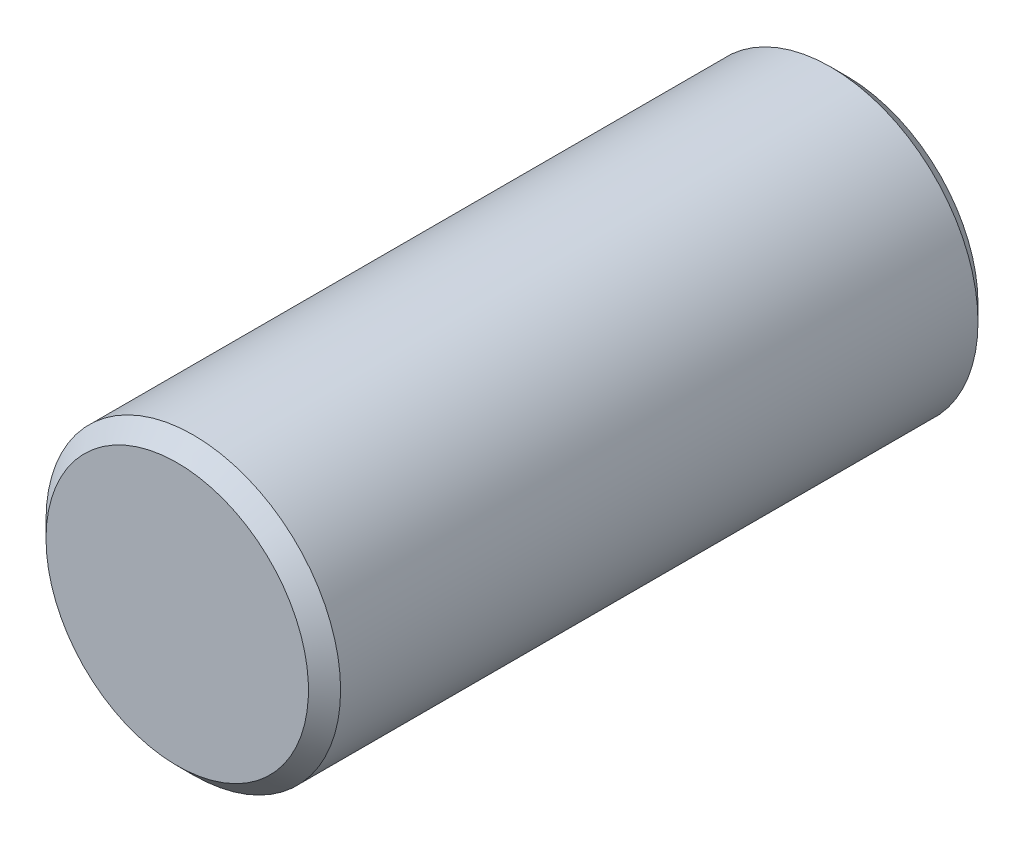
ISO-10303-21;
HEADER;
FILE_DESCRIPTION(('STEP AP214'),'2;1');
FILE_NAME('part.step','',(''),(''),'','','');
FILE_SCHEMA(('AUTOMOTIVE_DESIGN { 1 0 10303 214 1 1 1 1 }'));
ENDSEC;
DATA;
#1=APPLICATION_CONTEXT('core data for automotive mechanical design processes');
#2=APPLICATION_PROTOCOL_DEFINITION('international standard','automotive_design',2000,#1);
#3=PRODUCT_CONTEXT('',#1,'mechanical');
#4=PRODUCT('Part','Part','',(#3));
#5=PRODUCT_RELATED_PRODUCT_CATEGORY('part','',(#4));
#6=PRODUCT_DEFINITION_FORMATION('','',#4);
#7=PRODUCT_DEFINITION_CONTEXT('part definition',#1,'design');
#8=PRODUCT_DEFINITION('design','',#6,#7);
#9=PRODUCT_DEFINITION_SHAPE('','',#8);
#10=(LENGTH_UNIT() NAMED_UNIT(*) SI_UNIT(.MILLI.,.METRE.));
#11=(NAMED_UNIT(*) PLANE_ANGLE_UNIT() SI_UNIT($,.RADIAN.));
#12=(NAMED_UNIT(*) SI_UNIT($,.STERADIAN.) SOLID_ANGLE_UNIT());
#13=UNCERTAINTY_MEASURE_WITH_UNIT(LENGTH_MEASURE(1.E-05),#10,'distance_accuracy_value','');
#14=(GEOMETRIC_REPRESENTATION_CONTEXT(3) GLOBAL_UNCERTAINTY_ASSIGNED_CONTEXT((#13)) GLOBAL_UNIT_ASSIGNED_CONTEXT((#10,
#11,#12)) REPRESENTATION_CONTEXT('',''));
#15=CARTESIAN_POINT('',(0.,0.,0.));
#16=DIRECTION('',(0.,0.,1.));
#17=DIRECTION('',(1.,0.,0.));
#18=AXIS2_PLACEMENT_3D('',#15,#16,#17);
#19=CARTESIAN_POINT('',(1.11022302462516E-12,2.22044604925031E-13,62.499999999999));
#20=DIRECTION('',(0.,0.,-0.999999999999983));
#21=DIRECTION('',(-1.,0.,0.));
#22=AXIS2_PLACEMENT_3D('',#19,#20,#21);
#23=CYLINDRICAL_SURFACE('',#22,27.5);
#24=CARTESIAN_POINT('',(1.33226762955019E-12,-2.22044604925031E-13,-59.4999999999993));
#25=DIRECTION('',(0.,0.,0.999999999999983));
#26=DIRECTION('',(1.,0.,0.));
#27=AXIS2_PLACEMENT_3D('',#24,#25,#26);
#28=CIRCLE('',#27,27.5);
#29=CARTESIAN_POINT('',(-27.4999999999989,2.20518048266171E-13,-59.4999999999993));
#30=VERTEX_POINT('',#29);
#31=EDGE_CURVE('E43',#30,#30,#28,.T.);
#32=CARTESIAN_POINT('',(6.66133814775094E-13,-1.4432899320127E-12,59.4999999999992));
#33=DIRECTION('',(0.,0.,0.999999999999983));
#34=DIRECTION('',(1.,0.,0.));
#35=AXIS2_PLACEMENT_3D('',#32,#33,#34);
#36=CIRCLE('',#35,27.5);
#37=CARTESIAN_POINT('',(-27.4999999999989,2.20518048266172E-13,59.4999999999992));
#38=VERTEX_POINT('',#37);
#39=EDGE_CURVE('E47',#38,#38,#36,.F.);
#40=CARTESIAN_POINT('',(-27.4999999999989,2.20518048266171E-13,-59.4999999999993));
#41=CARTESIAN_POINT('',(-27.4999999999989,2.20518048266171E-13,-58.260416666666));
#42=CARTESIAN_POINT('',(-27.4999999999989,2.20518048266171E-13,-57.0208333333326));
#43=CARTESIAN_POINT('',(-27.4999999999989,2.20518048266171E-13,-54.541666666666));
#44=CARTESIAN_POINT('',(-27.4999999999989,2.20518048266171E-13,-53.3020833333327));
#45=CARTESIAN_POINT('',(-27.4999999999989,2.20518048266171E-13,-50.8229166666661));
#46=CARTESIAN_POINT('',(-27.4999999999989,2.20518048266171E-13,-49.5833333333327));
#47=CARTESIAN_POINT('',(-27.4999999999989,2.20518048266171E-13,-47.1041666666661));
#48=CARTESIAN_POINT('',(-27.4999999999989,2.20518048266171E-13,-45.8645833333328));
#49=CARTESIAN_POINT('',(-27.4999999999989,2.20518048266171E-13,-43.3854166666662));
#50=CARTESIAN_POINT('',(-27.4999999999989,2.20518048266171E-13,-42.1458333333328));
#51=CARTESIAN_POINT('',(-27.4999999999989,2.20518048266171E-13,-39.6666666666662));
#52=CARTESIAN_POINT('',(-27.4999999999989,2.20518048266171E-13,-38.4270833333329));
#53=CARTESIAN_POINT('',(-27.4999999999989,2.20518048266171E-13,-35.9479166666662));
#54=CARTESIAN_POINT('',(-27.4999999999989,2.20518048266171E-13,-34.7083333333329));
#55=CARTESIAN_POINT('',(-27.4999999999989,2.20518048266171E-13,-32.2291666666663));
#56=CARTESIAN_POINT('',(-27.4999999999989,2.20518048266171E-13,-30.989583333333));
#57=CARTESIAN_POINT('',(-27.4999999999989,2.20518048266171E-13,-28.5104166666663));
#58=CARTESIAN_POINT('',(-27.4999999999989,2.20518048266171E-13,-27.270833333333));
#59=CARTESIAN_POINT('',(-27.4999999999989,2.20518048266171E-13,-24.7916666666664));
#60=CARTESIAN_POINT('',(-27.4999999999989,2.20518048266171E-13,-23.5520833333331));
#61=CARTESIAN_POINT('',(-27.4999999999989,2.20518048266171E-13,-21.0729166666664));
#62=CARTESIAN_POINT('',(-27.4999999999989,2.20518048266171E-13,-19.8333333333331));
#63=CARTESIAN_POINT('',(-27.4999999999989,2.20518048266171E-13,-17.3541666666665));
#64=CARTESIAN_POINT('',(-27.4999999999989,2.20518048266171E-13,-16.1145833333332));
#65=CARTESIAN_POINT('',(-27.4999999999989,2.20518048266171E-13,-13.6354166666665));
#66=CARTESIAN_POINT('',(-27.4999999999989,2.20518048266171E-13,-12.3958333333332));
#67=CARTESIAN_POINT('',(-27.4999999999989,2.20518048266171E-13,-9.91666666666658));
#68=CARTESIAN_POINT('',(-27.4999999999989,2.20518048266171E-13,-8.67708333333326));
#69=CARTESIAN_POINT('',(-27.4999999999989,2.20518048266171E-13,-6.19791666666663));
#70=CARTESIAN_POINT('',(-27.4999999999989,2.20518048266171E-13,-4.95833333333331));
#71=CARTESIAN_POINT('',(-27.4999999999989,2.20518048266171E-13,-2.47916666666668));
#72=CARTESIAN_POINT('',(-27.4999999999989,2.20518048266172E-13,-1.23958333333336));
#73=CARTESIAN_POINT('',(-27.4999999999989,2.20518048266172E-13,1.23958333333328));
#74=CARTESIAN_POINT('',(-27.4999999999989,2.20518048266172E-13,2.4791666666666));
#75=CARTESIAN_POINT('',(-27.4999999999989,2.20518048266172E-13,4.95833333333323));
#76=CARTESIAN_POINT('',(-27.4999999999989,2.20518048266172E-13,6.19791666666655));
#77=CARTESIAN_POINT('',(-27.4999999999989,2.20518048266172E-13,8.67708333333318));
#78=CARTESIAN_POINT('',(-27.4999999999989,2.20518048266172E-13,9.9166666666665));
#79=CARTESIAN_POINT('',(-27.4999999999989,2.20518048266172E-13,12.3958333333331));
#80=CARTESIAN_POINT('',(-27.4999999999989,2.20518048266172E-13,13.6354166666664));
#81=CARTESIAN_POINT('',(-27.4999999999989,2.20518048266172E-13,16.1145833333331));
#82=CARTESIAN_POINT('',(-27.4999999999989,2.20518048266172E-13,17.3541666666664));
#83=CARTESIAN_POINT('',(-27.4999999999989,2.20518048266172E-13,19.833333333333));
#84=CARTESIAN_POINT('',(-27.4999999999989,2.20518048266172E-13,21.0729166666664));
#85=CARTESIAN_POINT('',(-27.4999999999989,2.20518048266172E-13,23.552083333333));
#86=CARTESIAN_POINT('',(-27.4999999999989,2.20518048266172E-13,24.7916666666663));
#87=CARTESIAN_POINT('',(-27.4999999999989,2.20518048266172E-13,27.2708333333329));
#88=CARTESIAN_POINT('',(-27.4999999999989,2.20518048266172E-13,28.5104166666663));
#89=CARTESIAN_POINT('',(-27.4999999999989,2.20518048266172E-13,30.9895833333329));
#90=CARTESIAN_POINT('',(-27.4999999999989,2.20518048266172E-13,32.2291666666662));
#91=CARTESIAN_POINT('',(-27.4999999999989,2.20518048266172E-13,34.7083333333328));
#92=CARTESIAN_POINT('',(-27.4999999999989,2.20518048266172E-13,35.9479166666662));
#93=CARTESIAN_POINT('',(-27.4999999999989,2.20518048266172E-13,38.4270833333328));
#94=CARTESIAN_POINT('',(-27.4999999999989,2.20518048266172E-13,39.6666666666661));
#95=CARTESIAN_POINT('',(-27.4999999999989,2.20518048266172E-13,42.1458333333328));
#96=CARTESIAN_POINT('',(-27.4999999999989,2.20518048266172E-13,43.3854166666661));
#97=CARTESIAN_POINT('',(-27.4999999999989,2.20518048266172E-13,45.8645833333327));
#98=CARTESIAN_POINT('',(-27.4999999999989,2.20518048266172E-13,47.104166666666));
#99=CARTESIAN_POINT('',(-27.4999999999989,2.20518048266172E-13,49.5833333333327));
#100=CARTESIAN_POINT('',(-27.4999999999989,2.20518048266172E-13,50.822916666666));
#101=CARTESIAN_POINT('',(-27.4999999999989,2.20518048266172E-13,53.3020833333326));
#102=CARTESIAN_POINT('',(-27.4999999999989,2.20518048266172E-13,54.5416666666659));
#103=CARTESIAN_POINT('',(-27.4999999999989,2.20518048266172E-13,57.0208333333326));
#104=CARTESIAN_POINT('',(-27.4999999999989,2.20518048266172E-13,58.2604166666659));
#105=CARTESIAN_POINT('',(-27.4999999999989,2.20518048266172E-13,59.4999999999992));
#106=B_SPLINE_CURVE_WITH_KNOTS('',3,(#40,#41,#42,#43,#44,#45,#46,#47,#48,#49,#50,#51,#52,#53,
#54,#55,#56,#57,#58,#59,#60,#61,#62,#63,#64,#65,#66,#67,#68,#69,#70,#71,#72,#73,#74,#75,#76,#77,
#78,#79,#80,#81,#82,#83,#84,#85,#86,#87,#88,#89,#90,#91,#92,#93,#94,#95,#96,#97,#98,#99,#100,
#101,#102,#103,#104,#105),.UNSPECIFIED.,.F.,.F.,(4,2,2,2,2,2,2,2,2,2,2,2,2,2,2,2,2,2,2,2,2,2,2,
2,2,2,2,2,2,2,2,2,4),(0.,3.71874999999997,7.4374999999999,11.1562499999999,14.8749999999998,
18.5937499999998,22.3124999999997,26.0312499999997,29.7499999999996,33.4687499999996,
37.1874999999995,40.9062499999995,44.6249999999994,48.3437499999994,52.0624999999993,
55.7812499999993,59.4999999999992,63.2187499999992,66.9374999999991,70.6562499999991,
74.374999999999,78.093749999999,81.812499999999,85.5312499999989,89.2499999999989,
92.9687499999988,96.6874999999988,100.406249999999,104.124999999999,107.843749999999,
111.562499999999,115.281249999999,118.999999999998),.UNSPECIFIED.);
#107=EDGE_CURVE('BSEAM32',#30,#38,#106,.T.);
#108=ORIENTED_EDGE('',*,*,#31,.T.);
#109=ORIENTED_EDGE('',*,*,#39,.T.);
#110=ORIENTED_EDGE('',*,*,#107,.T.);
#111=ORIENTED_EDGE('',*,*,#107,.F.);
#112=EDGE_LOOP('',(#108,#110,#109,#111));
#113=FACE_BOUND('',#112,.T.);
#114=ADVANCED_FACE('F32',(#113),#23,.T.);
#115=CARTESIAN_POINT('',(1.11022302462516E-12,2.22044604925031E-13,62.499999999999));
#116=DIRECTION('',(0.,0.,0.999999999999983));
#117=DIRECTION('',(1.,0.,0.));
#118=AXIS2_PLACEMENT_3D('',#115,#116,#117);
#119=PLANE('',#118);
#120=CARTESIAN_POINT('',(1.11022302462516E-12,2.22044604925031E-13,62.499999999999));
#121=DIRECTION('',(0.,0.,0.999999999999983));
#122=DIRECTION('',(1.,0.,0.));
#123=AXIS2_PLACEMENT_3D('',#120,#121,#122);
#124=CIRCLE('',#123,24.5);
#125=CARTESIAN_POINT('',(-24.4999999999989,2.20684581719865E-13,62.499999999999));
#126=VERTEX_POINT('',#125);
#127=EDGE_CURVE('E10',#126,#126,#124,.T.);
#128=ORIENTED_EDGE('',*,*,#127,.T.);
#129=EDGE_LOOP('',(#128));
#130=FACE_BOUND('',#129,.T.);
#131=ADVANCED_FACE('F63',(#130),#119,.T.);
#132=CARTESIAN_POINT('',(4.44089209850063E-13,-1.77635683940025E-12,-62.4999999999992));
#133=DIRECTION('',(0.,0.,0.999999999999983));
#134=DIRECTION('',(1.,0.,0.));
#135=AXIS2_PLACEMENT_3D('',#132,#133,#134);
#136=PLANE('',#135);
#137=CARTESIAN_POINT('',(4.44089209850063E-13,-1.77635683940025E-12,-62.4999999999992));
#138=DIRECTION('',(0.,0.,0.999999999999983));
#139=DIRECTION('',(1.,0.,0.));
#140=AXIS2_PLACEMENT_3D('',#137,#138,#139);
#141=CIRCLE('',#140,24.5);
#142=CARTESIAN_POINT('',(24.5000000000004,-1.77499681619508E-12,-62.4999999999992));
#143=VERTEX_POINT('',#142);
#144=EDGE_CURVE('E39',#143,#143,#141,.F.);
#145=ORIENTED_EDGE('',*,*,#144,.T.);
#146=EDGE_LOOP('',(#145));
#147=FACE_BOUND('',#146,.T.);
#148=ADVANCED_FACE('F60',(#147),#136,.F.);
#149=CARTESIAN_POINT('',(1.33226762955019E-12,-2.22044604925031E-13,-59.4999999999993));
#150=DIRECTION('',(0.,0.,0.999999999999983));
#151=DIRECTION('',(1.,0.,0.));
#152=AXIS2_PLACEMENT_3D('',#149,#150,#151);
#153=CONICAL_SURFACE('',#152,27.5,0.785398163397451);
#154=ORIENTED_EDGE('',*,*,#144,.F.);
#155=EDGE_LOOP('',(#154));
#156=FACE_BOUND('',#155,.T.);
#157=ORIENTED_EDGE('',*,*,#31,.F.);
#158=EDGE_LOOP('',(#157));
#159=FACE_BOUND('',#158,.T.);
#160=ADVANCED_FACE('F56',(#156,#159),#153,.T.);
#161=CARTESIAN_POINT('',(1.11022302462516E-12,2.22044604925031E-13,62.499999999999));
#162=DIRECTION('',(0.,0.,-0.999999999999983));
#163=DIRECTION('',(-1.,0.,0.));
#164=AXIS2_PLACEMENT_3D('',#161,#162,#163);
#165=CONICAL_SURFACE('',#164,24.5,0.785398163397448);
#166=CARTESIAN_POINT('',(-27.4999999999987,2.20518048266172E-13,59.4999999999992));
#167=CARTESIAN_POINT('',(-27.4687499999987,2.20519782989648E-13,59.5312499999992));
#168=CARTESIAN_POINT('',(-27.4374999999987,2.20521517713124E-13,59.5624999999992));
#169=CARTESIAN_POINT('',(-27.3749999999987,2.20524987160076E-13,59.6249999999992));
#170=CARTESIAN_POINT('',(-27.3437499999987,2.20526721883552E-13,59.6562499999992));
#171=CARTESIAN_POINT('',(-27.2812499999987,2.20530191330504E-13,59.7187499999992));
#172=CARTESIAN_POINT('',(-27.2499999999987,2.2053192605398E-13,59.7499999999992));
#173=CARTESIAN_POINT('',(-27.1874999999987,2.20535395500932E-13,59.8124999999992));
#174=CARTESIAN_POINT('',(-27.1562499999987,2.20537130224407E-13,59.8437499999992));
#175=CARTESIAN_POINT('',(-27.0937499999987,2.20540599671359E-13,59.9062499999992));
#176=CARTESIAN_POINT('',(-27.0624999999988,2.20542334394835E-13,59.9374999999992));
#177=CARTESIAN_POINT('',(-26.9999999999988,2.20545803841787E-13,59.9999999999992));
#178=CARTESIAN_POINT('',(-26.9687499999988,2.20547538565263E-13,60.0312499999992));
#179=CARTESIAN_POINT('',(-26.9062499999988,2.20551008012215E-13,60.0937499999992));
#180=CARTESIAN_POINT('',(-26.8749999999988,2.20552742735691E-13,60.1249999999992));
#181=CARTESIAN_POINT('',(-26.8124999999988,2.20556212182643E-13,60.1874999999992));
#182=CARTESIAN_POINT('',(-26.7812499999988,2.20557946906119E-13,60.2187499999992));
#183=CARTESIAN_POINT('',(-26.7187499999988,2.20561416353071E-13,60.2812499999991));
#184=CARTESIAN_POINT('',(-26.6874999999988,2.20563151076547E-13,60.3124999999991));
#185=CARTESIAN_POINT('',(-26.6249999999988,2.20566620523499E-13,60.3749999999991));
#186=CARTESIAN_POINT('',(-26.5937499999988,2.20568355246975E-13,60.4062499999991));
#187=CARTESIAN_POINT('',(-26.5312499999988,2.20571824693927E-13,60.4687499999991));
#188=CARTESIAN_POINT('',(-26.4999999999988,2.20573559417403E-13,60.4999999999991));
#189=CARTESIAN_POINT('',(-26.4374999999988,2.20577028864355E-13,60.5624999999991));
#190=CARTESIAN_POINT('',(-26.4062499999988,2.20578763587831E-13,60.5937499999991));
#191=CARTESIAN_POINT('',(-26.3437499999988,2.20582233034783E-13,60.6562499999991));
#192=CARTESIAN_POINT('',(-26.3124999999988,2.20583967758259E-13,60.6874999999991));
#193=CARTESIAN_POINT('',(-26.2499999999988,2.20587437205211E-13,60.7499999999991));
#194=CARTESIAN_POINT('',(-26.2187499999988,2.20589171928687E-13,60.7812499999991));
#195=CARTESIAN_POINT('',(-26.1562499999988,2.20592641375639E-13,60.8437499999991));
#196=CARTESIAN_POINT('',(-26.1249999999988,2.20594376099115E-13,60.8749999999991));
#197=CARTESIAN_POINT('',(-26.0624999999988,2.20597845546067E-13,60.9374999999991));
#198=CARTESIAN_POINT('',(-26.0312499999988,2.20599580269543E-13,60.9687499999991));
#199=CARTESIAN_POINT('',(-25.9687499999988,2.20603049716495E-13,61.0312499999991));
#200=CARTESIAN_POINT('',(-25.9374999999988,2.20604784439971E-13,61.0624999999991));
#201=CARTESIAN_POINT('',(-25.8749999999988,2.20608253886923E-13,61.1249999999991));
#202=CARTESIAN_POINT('',(-25.8437499999988,2.20609988610398E-13,61.1562499999991));
#203=CARTESIAN_POINT('',(-25.7812499999988,2.2061345805735E-13,61.2187499999991));
#204=CARTESIAN_POINT('',(-25.7499999999988,2.20615192780826E-13,61.2499999999991));
#205=CARTESIAN_POINT('',(-25.6874999999988,2.20618662227778E-13,61.3124999999991));
#206=CARTESIAN_POINT('',(-25.6562499999988,2.20620396951254E-13,61.3437499999991));
#207=CARTESIAN_POINT('',(-25.5937499999988,2.20623866398206E-13,61.4062499999991));
#208=CARTESIAN_POINT('',(-25.5624999999988,2.20625601121682E-13,61.4374999999991));
#209=CARTESIAN_POINT('',(-25.4999999999988,2.20629070568634E-13,61.4999999999991));
#210=CARTESIAN_POINT('',(-25.4687499999988,2.2063080529211E-13,61.5312499999991));
#211=CARTESIAN_POINT('',(-25.4062499999988,2.20634274739062E-13,61.593749999999));
#212=CARTESIAN_POINT('',(-25.3749999999988,2.20636009462538E-13,61.624999999999));
#213=CARTESIAN_POINT('',(-25.3124999999989,2.2063947890949E-13,61.687499999999));
#214=CARTESIAN_POINT('',(-25.2812499999989,2.20641213632966E-13,61.718749999999));
#215=CARTESIAN_POINT('',(-25.2187499999989,2.20644683079918E-13,61.781249999999));
#216=CARTESIAN_POINT('',(-25.1874999999989,2.20646417803394E-13,61.812499999999));
#217=CARTESIAN_POINT('',(-25.1249999999989,2.20649887250346E-13,61.874999999999));
#218=CARTESIAN_POINT('',(-25.0937499999989,2.20651621973822E-13,61.906249999999));
#219=CARTESIAN_POINT('',(-25.0312499999989,2.20655091420774E-13,61.968749999999));
#220=CARTESIAN_POINT('',(-24.9999999999989,2.2065682614425E-13,61.999999999999));
#221=CARTESIAN_POINT('',(-24.9374999999989,2.20660295591202E-13,62.062499999999));
#222=CARTESIAN_POINT('',(-24.9062499999989,2.20662030314678E-13,62.093749999999));
#223=CARTESIAN_POINT('',(-24.8437499999989,2.2066549976163E-13,62.156249999999));
#224=CARTESIAN_POINT('',(-24.8124999999989,2.20667234485106E-13,62.187499999999));
#225=CARTESIAN_POINT('',(-24.7499999999989,2.20670703932058E-13,62.249999999999));
#226=CARTESIAN_POINT('',(-24.7187499999989,2.20672438655534E-13,62.281249999999));
#227=CARTESIAN_POINT('',(-24.6562499999989,2.20675908102486E-13,62.343749999999));
#228=CARTESIAN_POINT('',(-24.6249999999989,2.20677642825962E-13,62.374999999999));
#229=CARTESIAN_POINT('',(-24.5624999999989,2.20681112272914E-13,62.437499999999));
#230=CARTESIAN_POINT('',(-24.5312499999989,2.20682846996389E-13,62.468749999999));
#231=CARTESIAN_POINT('',(-24.4999999999989,2.20684581719865E-13,62.499999999999));
#232=B_SPLINE_CURVE_WITH_KNOTS('',3,(#166,#167,#168,#169,#170,#171,#172,#173,#174,#175,#176,
#177,#178,#179,#180,#181,#182,#183,#184,#185,#186,#187,#188,#189,#190,#191,#192,#193,#194,#195,
#196,#197,#198,#199,#200,#201,#202,#203,#204,#205,#206,#207,#208,#209,#210,#211,#212,#213,#214,
#215,#216,#217,#218,#219,#220,#221,#222,#223,#224,#225,#226,#227,#228,#229,#230,#231),
.UNSPECIFIED.,.F.,.F.,(4,2,2,2,2,2,2,2,2,2,2,2,2,2,2,2,2,2,2,2,2,2,2,2,2,2,2,2,2,2,2,2,4),(0.,
0.132582521472473,0.265165042944938,0.397747564417411,0.530330085889877,0.662912607362347,
0.795495128834815,0.928077650307286,1.06066017177976,1.19324269325222,1.32582521472469,
1.45840773619716,1.59099025766963,1.7235727791421,1.85615530061457,1.98873782208704,
2.1213203435595,2.25390286503198,2.38648538650444,2.51906790797691,2.65165042944939,
2.78423295092185,2.91681547239432,3.04939799386679,3.18198051533926,3.31456303681173,
3.44714555828419,3.57972807975667,3.71231060122913,3.8448931227016,3.97747564417408,
4.11005816564654,4.24264068711901),.UNSPECIFIED.);
#233=EDGE_CURVE('BSEAM34',#38,#126,#232,.T.);
#234=ORIENTED_EDGE('',*,*,#39,.F.);
#235=ORIENTED_EDGE('',*,*,#127,.F.);
#236=ORIENTED_EDGE('',*,*,#233,.T.);
#237=ORIENTED_EDGE('',*,*,#233,.F.);
#238=EDGE_LOOP('',(#234,#236,#235,#237));
#239=FACE_BOUND('',#238,.T.);
#240=ADVANCED_FACE('F34',(#239),#165,.T.);
#241=CLOSED_SHELL('',(#114,#131,#148,#160,#240));
#242=MANIFOLD_SOLID_BREP('B2',#241);
#243=ADVANCED_BREP_SHAPE_REPRESENTATION('',(#18,#242),#14);
#244=SHAPE_DEFINITION_REPRESENTATION(#9,#243);
ENDSEC;
END-ISO-10303-21;
